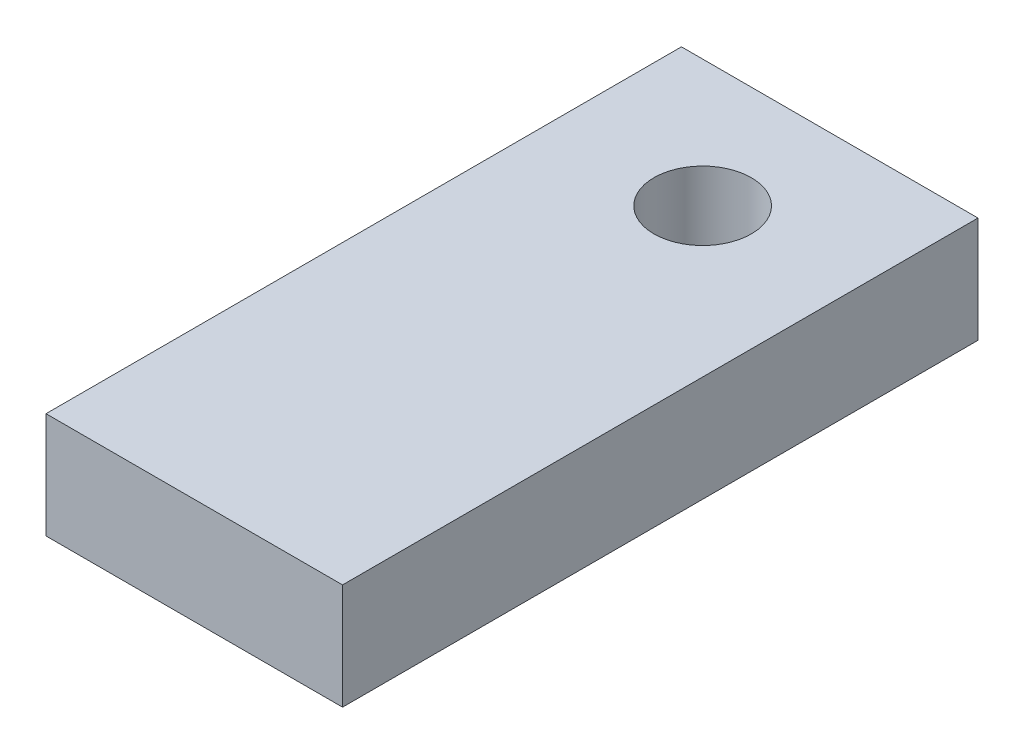
ISO-10303-21;
HEADER;
FILE_DESCRIPTION(('STEP AP214'),'2;1');
FILE_NAME('part.step','',(''),(''),'','','');
FILE_SCHEMA(('AUTOMOTIVE_DESIGN { 1 0 10303 214 1 1 1 1 }'));
ENDSEC;
DATA;
#1=APPLICATION_CONTEXT('core data for automotive mechanical design processes');
#2=APPLICATION_PROTOCOL_DEFINITION('international standard','automotive_design',2000,#1);
#3=PRODUCT_CONTEXT('',#1,'mechanical');
#4=PRODUCT('Part','Part','',(#3));
#5=PRODUCT_RELATED_PRODUCT_CATEGORY('part','',(#4));
#6=PRODUCT_DEFINITION_FORMATION('','',#4);
#7=PRODUCT_DEFINITION_CONTEXT('part definition',#1,'design');
#8=PRODUCT_DEFINITION('design','',#6,#7);
#9=PRODUCT_DEFINITION_SHAPE('','',#8);
#10=(LENGTH_UNIT() NAMED_UNIT(*) SI_UNIT(.MILLI.,.METRE.));
#11=(NAMED_UNIT(*) PLANE_ANGLE_UNIT() SI_UNIT($,.RADIAN.));
#12=(NAMED_UNIT(*) SI_UNIT($,.STERADIAN.) SOLID_ANGLE_UNIT());
#13=UNCERTAINTY_MEASURE_WITH_UNIT(LENGTH_MEASURE(1.E-05),#10,'distance_accuracy_value','');
#14=(GEOMETRIC_REPRESENTATION_CONTEXT(3) GLOBAL_UNCERTAINTY_ASSIGNED_CONTEXT((#13)) GLOBAL_UNIT_ASSIGNED_CONTEXT((#10,
#11,#12)) REPRESENTATION_CONTEXT('',''));
#15=CARTESIAN_POINT('',(0.,0.,0.));
#16=DIRECTION('',(0.,0.,1.));
#17=DIRECTION('',(1.,0.,0.));
#18=AXIS2_PLACEMENT_3D('',#15,#16,#17);
#19=CARTESIAN_POINT('',(0.,3.175,0.));
#20=DIRECTION('',(0.,-1.,0.));
#21=DIRECTION('',(0.,0.,-1.));
#22=AXIS2_PLACEMENT_3D('',#19,#20,#21);
#23=PLANE('',#22);
#24=DIRECTION('',(0.,0.,1.));
#25=VECTOR('',#24,1.);
#26=CARTESIAN_POINT('',(0.,3.175,0.));
#27=LINE('',#26,#25);
#28=CARTESIAN_POINT('',(0.,3.175,-19.05));
#29=VERTEX_POINT('',#28);
#30=CARTESIAN_POINT('',(0.,3.175,0.));
#31=VERTEX_POINT('',#30);
#32=EDGE_CURVE('E91',#29,#31,#27,.T.);
#33=ORIENTED_EDGE('',*,*,#32,.T.);
#34=DIRECTION('',(1.,0.,0.));
#35=VECTOR('',#34,1.);
#36=CARTESIAN_POINT('',(0.,3.175,0.));
#37=LINE('',#36,#35);
#38=CARTESIAN_POINT('',(8.89,3.175,0.));
#39=VERTEX_POINT('',#38);
#40=EDGE_CURVE('E86',#31,#39,#37,.T.);
#41=ORIENTED_EDGE('',*,*,#40,.T.);
#42=DIRECTION('',(0.,0.,-1.));
#43=VECTOR('',#42,1.);
#44=CARTESIAN_POINT('',(8.89,3.175,0.));
#45=LINE('',#44,#43);
#46=CARTESIAN_POINT('',(8.89,3.175,-19.05));
#47=VERTEX_POINT('',#46);
#48=EDGE_CURVE('E89',#39,#47,#45,.T.);
#49=ORIENTED_EDGE('',*,*,#48,.T.);
#50=DIRECTION('',(-1.,0.,0.));
#51=VECTOR('',#50,1.);
#52=CARTESIAN_POINT('',(0.,3.175,-19.05));
#53=LINE('',#52,#51);
#54=EDGE_CURVE('E56',#47,#29,#53,.T.);
#55=ORIENTED_EDGE('',*,*,#54,.T.);
#56=EDGE_LOOP('',(#33,#41,#49,#55));
#57=FACE_BOUND('',#56,.T.);
#58=CARTESIAN_POINT('',(4.445,3.175,-15.24));
#59=DIRECTION('',(0.,1.,0.));
#60=DIRECTION('',(0.,0.,1.));
#61=AXIS2_PLACEMENT_3D('',#58,#59,#60);
#62=CIRCLE('',#61,1.4605);
#63=CARTESIAN_POINT('',(4.445,3.175,-13.7795));
#64=VERTEX_POINT('',#63);
#65=EDGE_CURVE('E106',#64,#64,#62,.T.);
#66=ORIENTED_EDGE('',*,*,#65,.F.);
#67=EDGE_LOOP('',(#66));
#68=FACE_BOUND('',#67,.T.);
#69=ADVANCED_FACE('F39',(#57,#68),#23,.F.);
#70=CARTESIAN_POINT('',(0.,0.,0.));
#71=DIRECTION('',(0.,-1.,0.));
#72=DIRECTION('',(0.,0.,-1.));
#73=AXIS2_PLACEMENT_3D('',#70,#71,#72);
#74=PLANE('',#73);
#75=DIRECTION('',(0.,0.,1.));
#76=VECTOR('',#75,1.);
#77=CARTESIAN_POINT('',(0.,0.,0.));
#78=LINE('',#77,#76);
#79=CARTESIAN_POINT('',(0.,0.,-19.05));
#80=VERTEX_POINT('',#79);
#81=CARTESIAN_POINT('',(0.,0.,0.));
#82=VERTEX_POINT('',#81);
#83=EDGE_CURVE('E103',#80,#82,#78,.T.);
#84=ORIENTED_EDGE('',*,*,#83,.F.);
#85=DIRECTION('',(-1.,0.,0.));
#86=VECTOR('',#85,1.);
#87=CARTESIAN_POINT('',(0.,0.,-19.05));
#88=LINE('',#87,#86);
#89=CARTESIAN_POINT('',(8.89,0.,-19.05));
#90=VERTEX_POINT('',#89);
#91=EDGE_CURVE('E79',#90,#80,#88,.T.);
#92=ORIENTED_EDGE('',*,*,#91,.F.);
#93=DIRECTION('',(0.,0.,-1.));
#94=VECTOR('',#93,1.);
#95=CARTESIAN_POINT('',(8.89,0.,0.));
#96=LINE('',#95,#94);
#97=CARTESIAN_POINT('',(8.89,0.,0.));
#98=VERTEX_POINT('',#97);
#99=EDGE_CURVE('E73',#98,#90,#96,.T.);
#100=ORIENTED_EDGE('',*,*,#99,.F.);
#101=DIRECTION('',(1.,0.,0.));
#102=VECTOR('',#101,1.);
#103=CARTESIAN_POINT('',(0.,0.,0.));
#104=LINE('',#103,#102);
#105=EDGE_CURVE('E95',#82,#98,#104,.T.);
#106=ORIENTED_EDGE('',*,*,#105,.F.);
#107=EDGE_LOOP('',(#84,#92,#100,#106));
#108=FACE_BOUND('',#107,.T.);
#109=CARTESIAN_POINT('',(4.445,0.,-15.24));
#110=DIRECTION('',(0.,1.,0.));
#111=DIRECTION('',(0.,0.,1.));
#112=AXIS2_PLACEMENT_3D('',#109,#110,#111);
#113=CIRCLE('',#112,1.4605);
#114=CARTESIAN_POINT('',(4.445,0.,-13.7795));
#115=VERTEX_POINT('',#114);
#116=EDGE_CURVE('E118',#115,#115,#113,.T.);
#117=ORIENTED_EDGE('',*,*,#116,.T.);
#118=EDGE_LOOP('',(#117));
#119=FACE_BOUND('',#118,.T.);
#120=ADVANCED_FACE('F114',(#108,#119),#74,.T.);
#121=CARTESIAN_POINT('',(0.,3.175,0.));
#122=DIRECTION('',(1.,0.,0.));
#123=DIRECTION('',(0.,0.,-1.));
#124=AXIS2_PLACEMENT_3D('',#121,#122,#123);
#125=PLANE('',#124);
#126=ORIENTED_EDGE('',*,*,#83,.T.);
#127=DIRECTION('',(0.,-1.,0.));
#128=VECTOR('',#127,1.);
#129=CARTESIAN_POINT('',(0.,3.175,0.));
#130=LINE('',#129,#128);
#131=EDGE_CURVE('E11',#31,#82,#130,.T.);
#132=ORIENTED_EDGE('',*,*,#131,.F.);
#133=ORIENTED_EDGE('',*,*,#32,.F.);
#134=DIRECTION('',(0.,-1.,0.));
#135=VECTOR('',#134,1.);
#136=CARTESIAN_POINT('',(0.,3.175,-19.05));
#137=LINE('',#136,#135);
#138=EDGE_CURVE('E99',#29,#80,#137,.T.);
#139=ORIENTED_EDGE('',*,*,#138,.T.);
#140=EDGE_LOOP('',(#126,#132,#133,#139));
#141=FACE_BOUND('',#140,.T.);
#142=ADVANCED_FACE('F41',(#141),#125,.F.);
#143=CARTESIAN_POINT('',(0.,3.175,0.));
#144=DIRECTION('',(0.,0.,-1.));
#145=DIRECTION('',(-1.,0.,0.));
#146=AXIS2_PLACEMENT_3D('',#143,#144,#145);
#147=PLANE('',#146);
#148=ORIENTED_EDGE('',*,*,#105,.T.);
#149=DIRECTION('',(0.,-1.,0.));
#150=VECTOR('',#149,1.);
#151=CARTESIAN_POINT('',(8.89,3.175,0.));
#152=LINE('',#151,#150);
#153=EDGE_CURVE('E48',#39,#98,#152,.T.);
#154=ORIENTED_EDGE('',*,*,#153,.F.);
#155=ORIENTED_EDGE('',*,*,#40,.F.);
#156=ORIENTED_EDGE('',*,*,#131,.T.);
#157=EDGE_LOOP('',(#148,#154,#155,#156));
#158=FACE_BOUND('',#157,.T.);
#159=ADVANCED_FACE('F94',(#158),#147,.F.);
#160=CARTESIAN_POINT('',(8.89,3.175,0.));
#161=DIRECTION('',(-1.,0.,0.));
#162=DIRECTION('',(0.,0.,1.));
#163=AXIS2_PLACEMENT_3D('',#160,#161,#162);
#164=PLANE('',#163);
#165=ORIENTED_EDGE('',*,*,#99,.T.);
#166=DIRECTION('',(0.,-1.,0.));
#167=VECTOR('',#166,1.);
#168=CARTESIAN_POINT('',(8.89,3.175,-19.05));
#169=LINE('',#168,#167);
#170=EDGE_CURVE('E96',#47,#90,#169,.T.);
#171=ORIENTED_EDGE('',*,*,#170,.F.);
#172=ORIENTED_EDGE('',*,*,#48,.F.);
#173=ORIENTED_EDGE('',*,*,#153,.T.);
#174=EDGE_LOOP('',(#165,#171,#172,#173));
#175=FACE_BOUND('',#174,.T.);
#176=ADVANCED_FACE('F97',(#175),#164,.F.);
#177=CARTESIAN_POINT('',(0.,3.175,-19.05));
#178=DIRECTION('',(0.,0.,1.));
#179=DIRECTION('',(1.,0.,0.));
#180=AXIS2_PLACEMENT_3D('',#177,#178,#179);
#181=PLANE('',#180);
#182=ORIENTED_EDGE('',*,*,#91,.T.);
#183=ORIENTED_EDGE('',*,*,#138,.F.);
#184=ORIENTED_EDGE('',*,*,#54,.F.);
#185=ORIENTED_EDGE('',*,*,#170,.T.);
#186=EDGE_LOOP('',(#182,#183,#184,#185));
#187=FACE_BOUND('',#186,.T.);
#188=ADVANCED_FACE('F111',(#187),#181,.F.);
#189=CARTESIAN_POINT('',(4.445,3.175,-15.24));
#190=DIRECTION('',(0.,-1.,0.));
#191=DIRECTION('',(0.,0.,-1.));
#192=AXIS2_PLACEMENT_3D('',#189,#190,#191);
#193=CYLINDRICAL_SURFACE('',#192,1.4605);
#194=ORIENTED_EDGE('',*,*,#65,.T.);
#195=EDGE_LOOP('',(#194));
#196=FACE_BOUND('',#195,.T.);
#197=ORIENTED_EDGE('',*,*,#116,.F.);
#198=EDGE_LOOP('',(#197));
#199=FACE_BOUND('',#198,.T.);
#200=ADVANCED_FACE('F124',(#196,#199),#193,.F.);
#201=CLOSED_SHELL('',(#69,#120,#142,#159,#176,#188,#200));
#202=MANIFOLD_SOLID_BREP('B2',#201);
#203=ADVANCED_BREP_SHAPE_REPRESENTATION('',(#18,#202),#14);
#204=SHAPE_DEFINITION_REPRESENTATION(#9,#203);
ENDSEC;
END-ISO-10303-21;
